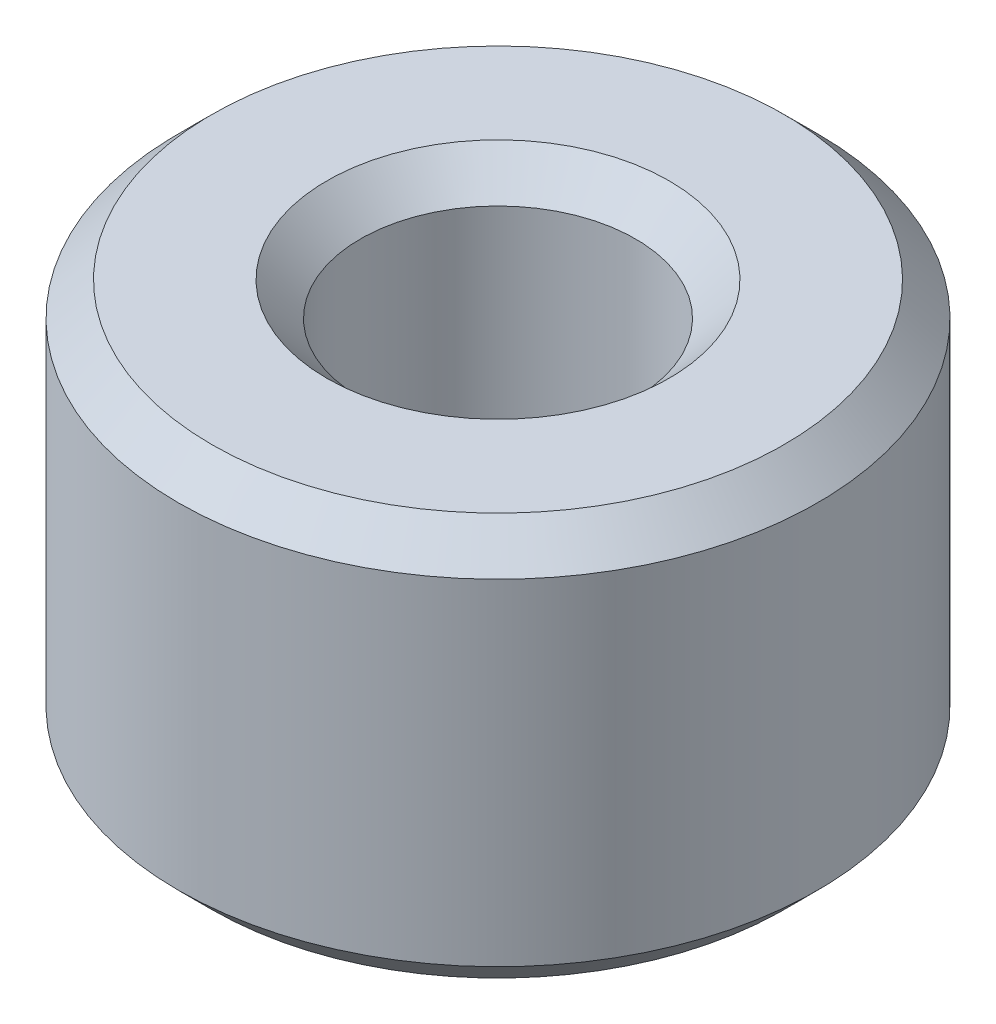
ISO-10303-21;
HEADER;
FILE_DESCRIPTION(('STEP AP214'),'2;1');
FILE_NAME('part.step','',(''),(''),'','','');
FILE_SCHEMA(('AUTOMOTIVE_DESIGN { 1 0 10303 214 1 1 1 1 }'));
ENDSEC;
DATA;
#1=APPLICATION_CONTEXT('core data for automotive mechanical design processes');
#2=APPLICATION_PROTOCOL_DEFINITION('international standard','automotive_design',2000,#1);
#3=PRODUCT_CONTEXT('',#1,'mechanical');
#4=PRODUCT('Part','Part','',(#3));
#5=PRODUCT_RELATED_PRODUCT_CATEGORY('part','',(#4));
#6=PRODUCT_DEFINITION_FORMATION('','',#4);
#7=PRODUCT_DEFINITION_CONTEXT('part definition',#1,'design');
#8=PRODUCT_DEFINITION('design','',#6,#7);
#9=PRODUCT_DEFINITION_SHAPE('','',#8);
#10=(LENGTH_UNIT() NAMED_UNIT(*) SI_UNIT(.MILLI.,.METRE.));
#11=(NAMED_UNIT(*) PLANE_ANGLE_UNIT() SI_UNIT($,.RADIAN.));
#12=(NAMED_UNIT(*) SI_UNIT($,.STERADIAN.) SOLID_ANGLE_UNIT());
#13=UNCERTAINTY_MEASURE_WITH_UNIT(LENGTH_MEASURE(1.E-05),#10,'distance_accuracy_value','');
#14=(GEOMETRIC_REPRESENTATION_CONTEXT(3) GLOBAL_UNCERTAINTY_ASSIGNED_CONTEXT((#13)) GLOBAL_UNIT_ASSIGNED_CONTEXT((#10,
#11,#12)) REPRESENTATION_CONTEXT('',''));
#15=CARTESIAN_POINT('',(0.,0.,0.));
#16=DIRECTION('',(0.,0.,1.));
#17=DIRECTION('',(1.,0.,0.));
#18=AXIS2_PLACEMENT_3D('',#15,#16,#17);
#19=CARTESIAN_POINT('',(0.,19.4703841816037,0.));
#20=DIRECTION('',(0.,-1.,0.));
#21=DIRECTION('',(0.,0.,-1.));
#22=AXIS2_PLACEMENT_3D('',#19,#20,#21);
#23=CYLINDRICAL_SURFACE('',#22,4.7625);
#24=CARTESIAN_POINT('',(0.,0.5,0.));
#25=DIRECTION('',(0.,1.,0.));
#26=DIRECTION('',(0.,0.,1.));
#27=AXIS2_PLACEMENT_3D('',#24,#25,#26);
#28=CIRCLE('',#27,4.7625);
#29=CARTESIAN_POINT('',(0.,0.5,4.7625));
#30=VERTEX_POINT('',#29);
#31=EDGE_CURVE('E46',#30,#30,#28,.T.);
#32=ORIENTED_EDGE('',*,*,#31,.T.);
#33=EDGE_LOOP('',(#32));
#34=FACE_BOUND('',#33,.T.);
#35=CARTESIAN_POINT('',(0.,5.5,0.));
#36=DIRECTION('',(0.,1.,0.));
#37=DIRECTION('',(0.,0.,1.));
#38=AXIS2_PLACEMENT_3D('',#35,#36,#37);
#39=CIRCLE('',#38,4.7625);
#40=CARTESIAN_POINT('',(0.,5.5,4.7625));
#41=VERTEX_POINT('',#40);
#42=EDGE_CURVE('E50',#41,#41,#39,.F.);
#43=ORIENTED_EDGE('',*,*,#42,.T.);
#44=EDGE_LOOP('',(#43));
#45=FACE_BOUND('',#44,.T.);
#46=ADVANCED_FACE('F34',(#34,#45),#23,.T.);
#47=CARTESIAN_POINT('',(0.,0.,0.));
#48=DIRECTION('',(0.,1.,0.));
#49=DIRECTION('',(0.,0.,1.));
#50=AXIS2_PLACEMENT_3D('',#47,#48,#49);
#51=PLANE('',#50);
#52=CARTESIAN_POINT('',(0.,0.,0.));
#53=DIRECTION('',(0.,1.,0.));
#54=DIRECTION('',(0.,0.,1.));
#55=AXIS2_PLACEMENT_3D('',#52,#53,#54);
#56=CIRCLE('',#55,2.55);
#57=CARTESIAN_POINT('',(0.,0.,2.55));
#58=VERTEX_POINT('',#57);
#59=EDGE_CURVE('E61',#58,#58,#56,.T.);
#60=ORIENTED_EDGE('',*,*,#59,.T.);
#61=EDGE_LOOP('',(#60));
#62=FACE_BOUND('',#61,.T.);
#63=CARTESIAN_POINT('',(0.,0.,0.));
#64=DIRECTION('',(0.,1.,0.));
#65=DIRECTION('',(0.,0.,1.));
#66=AXIS2_PLACEMENT_3D('',#63,#64,#65);
#67=CIRCLE('',#66,4.2625);
#68=CARTESIAN_POINT('',(0.,0.,4.2625));
#69=VERTEX_POINT('',#68);
#70=EDGE_CURVE('E64',#69,#69,#67,.F.);
#71=ORIENTED_EDGE('',*,*,#70,.T.);
#72=EDGE_LOOP('',(#71));
#73=FACE_BOUND('',#72,.T.);
#74=ADVANCED_FACE('F68',(#62,#73),#51,.F.);
#75=CARTESIAN_POINT('',(0.,19.4703841816037,0.));
#76=DIRECTION('',(0.,-1.,0.));
#77=DIRECTION('',(0.,0.,-1.));
#78=AXIS2_PLACEMENT_3D('',#75,#76,#77);
#79=CYLINDRICAL_SURFACE('',#78,2.05);
#80=CARTESIAN_POINT('',(0.,0.5,0.));
#81=DIRECTION('',(0.,1.,0.));
#82=DIRECTION('',(0.,0.,1.));
#83=AXIS2_PLACEMENT_3D('',#80,#81,#82);
#84=CIRCLE('',#83,2.05);
#85=CARTESIAN_POINT('',(0.,0.5,2.05));
#86=VERTEX_POINT('',#85);
#87=EDGE_CURVE('E55',#86,#86,#84,.F.);
#88=ORIENTED_EDGE('',*,*,#87,.T.);
#89=EDGE_LOOP('',(#88));
#90=FACE_BOUND('',#89,.T.);
#91=CARTESIAN_POINT('',(0.,5.5,0.));
#92=DIRECTION('',(0.,1.,0.));
#93=DIRECTION('',(0.,0.,1.));
#94=AXIS2_PLACEMENT_3D('',#91,#92,#93);
#95=CIRCLE('',#94,2.05);
#96=CARTESIAN_POINT('',(0.,5.5,2.05));
#97=VERTEX_POINT('',#96);
#98=EDGE_CURVE('E58',#97,#97,#95,.T.);
#99=ORIENTED_EDGE('',*,*,#98,.T.);
#100=EDGE_LOOP('',(#99));
#101=FACE_BOUND('',#100,.T.);
#102=ADVANCED_FACE('F108',(#90,#101),#79,.F.);
#103=CARTESIAN_POINT('',(0.,6.,0.));
#104=DIRECTION('',(0.,1.,0.));
#105=DIRECTION('',(0.638584183922911,0.,0.769551973581713));
#106=AXIS2_PLACEMENT_3D('',#103,#104,#105);
#107=PLANE('',#106);
#108=CARTESIAN_POINT('',(0.,6.,0.));
#109=DIRECTION('',(0.,1.,0.));
#110=DIRECTION('',(0.,0.,1.));
#111=AXIS2_PLACEMENT_3D('',#108,#109,#110);
#112=CIRCLE('',#111,2.55);
#113=CARTESIAN_POINT('',(0.,6.,2.55));
#114=VERTEX_POINT('',#113);
#115=EDGE_CURVE('E11',#114,#114,#112,.F.);
#116=ORIENTED_EDGE('',*,*,#115,.T.);
#117=EDGE_LOOP('',(#116));
#118=FACE_BOUND('',#117,.T.);
#119=CARTESIAN_POINT('',(0.,6.,0.));
#120=DIRECTION('',(0.,1.,0.));
#121=DIRECTION('',(0.,0.,1.));
#122=AXIS2_PLACEMENT_3D('',#119,#120,#121);
#123=CIRCLE('',#122,4.2625);
#124=CARTESIAN_POINT('',(0.,6.,4.2625));
#125=VERTEX_POINT('',#124);
#126=EDGE_CURVE('E42',#125,#125,#123,.T.);
#127=ORIENTED_EDGE('',*,*,#126,.T.);
#128=EDGE_LOOP('',(#127));
#129=FACE_BOUND('',#128,.T.);
#130=ADVANCED_FACE('F103',(#118,#129),#107,.T.);
#131=CARTESIAN_POINT('',(0.,0.,0.));
#132=DIRECTION('',(0.,-1.,0.));
#133=DIRECTION('',(0.,0.,-1.));
#134=AXIS2_PLACEMENT_3D('',#131,#132,#133);
#135=CONICAL_SURFACE('',#134,2.55,0.785398163397448);
#136=ORIENTED_EDGE('',*,*,#87,.F.);
#137=EDGE_LOOP('',(#136));
#138=FACE_BOUND('',#137,.T.);
#139=ORIENTED_EDGE('',*,*,#59,.F.);
#140=EDGE_LOOP('',(#139));
#141=FACE_BOUND('',#140,.T.);
#142=ADVANCED_FACE('F74',(#138,#141),#135,.F.);
#143=CARTESIAN_POINT('',(0.,0.5,0.));
#144=DIRECTION('',(0.,1.,0.));
#145=DIRECTION('',(0.,0.,1.));
#146=AXIS2_PLACEMENT_3D('',#143,#144,#145);
#147=CONICAL_SURFACE('',#146,4.7625,0.785398163397449);
#148=ORIENTED_EDGE('',*,*,#70,.F.);
#149=EDGE_LOOP('',(#148));
#150=FACE_BOUND('',#149,.T.);
#151=ORIENTED_EDGE('',*,*,#31,.F.);
#152=EDGE_LOOP('',(#151));
#153=FACE_BOUND('',#152,.T.);
#154=ADVANCED_FACE('F70',(#150,#153),#147,.T.);
#155=CARTESIAN_POINT('',(0.,5.5,0.));
#156=DIRECTION('',(0.,1.,0.));
#157=DIRECTION('',(0.,0.,1.));
#158=AXIS2_PLACEMENT_3D('',#155,#156,#157);
#159=CONICAL_SURFACE('',#158,2.05,0.78539816339745);
#160=ORIENTED_EDGE('',*,*,#115,.F.);
#161=EDGE_LOOP('',(#160));
#162=FACE_BOUND('',#161,.T.);
#163=ORIENTED_EDGE('',*,*,#98,.F.);
#164=EDGE_LOOP('',(#163));
#165=FACE_BOUND('',#164,.T.);
#166=ADVANCED_FACE('F73',(#162,#165),#159,.F.);
#167=CARTESIAN_POINT('',(0.,6.,0.));
#168=DIRECTION('',(0.,-1.,0.));
#169=DIRECTION('',(0.,0.,-1.));
#170=AXIS2_PLACEMENT_3D('',#167,#168,#169);
#171=CONICAL_SURFACE('',#170,4.2625,0.785398163397447);
#172=ORIENTED_EDGE('',*,*,#42,.F.);
#173=EDGE_LOOP('',(#172));
#174=FACE_BOUND('',#173,.T.);
#175=ORIENTED_EDGE('',*,*,#126,.F.);
#176=EDGE_LOOP('',(#175));
#177=FACE_BOUND('',#176,.T.);
#178=ADVANCED_FACE('F37',(#174,#177),#171,.T.);
#179=CLOSED_SHELL('',(#46,#74,#102,#130,#142,#154,#166,#178));
#180=MANIFOLD_SOLID_BREP('B2',#179);
#181=ADVANCED_BREP_SHAPE_REPRESENTATION('',(#18,#180),#14);
#182=SHAPE_DEFINITION_REPRESENTATION(#9,#181);
ENDSEC;
END-ISO-10303-21;
